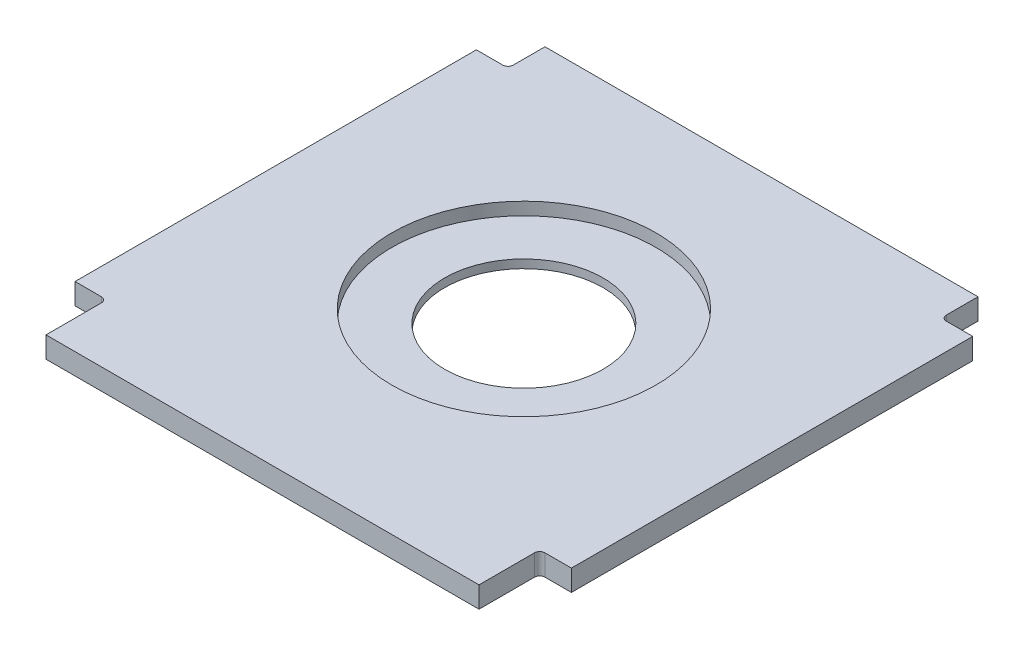
ISO-10303-21;
HEADER;
FILE_DESCRIPTION(('STEP AP214'),'2;1');
FILE_NAME('part.step','',(''),(''),'','','');
FILE_SCHEMA(('AUTOMOTIVE_DESIGN { 1 0 10303 214 1 1 1 1 }'));
ENDSEC;
DATA;
#1=APPLICATION_CONTEXT('core data for automotive mechanical design processes');
#2=APPLICATION_PROTOCOL_DEFINITION('international standard','automotive_design',2000,#1);
#3=PRODUCT_CONTEXT('',#1,'mechanical');
#4=PRODUCT('Part','Part','',(#3));
#5=PRODUCT_RELATED_PRODUCT_CATEGORY('part','',(#4));
#6=PRODUCT_DEFINITION_FORMATION('','',#4);
#7=PRODUCT_DEFINITION_CONTEXT('part definition',#1,'design');
#8=PRODUCT_DEFINITION('design','',#6,#7);
#9=PRODUCT_DEFINITION_SHAPE('','',#8);
#10=(LENGTH_UNIT() NAMED_UNIT(*) SI_UNIT(.MILLI.,.METRE.));
#11=(NAMED_UNIT(*) PLANE_ANGLE_UNIT() SI_UNIT($,.RADIAN.));
#12=(NAMED_UNIT(*) SI_UNIT($,.STERADIAN.) SOLID_ANGLE_UNIT());
#13=UNCERTAINTY_MEASURE_WITH_UNIT(LENGTH_MEASURE(1.E-05),#10,'distance_accuracy_value','');
#14=(GEOMETRIC_REPRESENTATION_CONTEXT(3) GLOBAL_UNCERTAINTY_ASSIGNED_CONTEXT((#13)) GLOBAL_UNIT_ASSIGNED_CONTEXT((#10,
#11,#12)) REPRESENTATION_CONTEXT('',''));
#15=CARTESIAN_POINT('',(0.,0.,0.));
#16=DIRECTION('',(0.,0.,1.));
#17=DIRECTION('',(1.,0.,0.));
#18=AXIS2_PLACEMENT_3D('',#15,#16,#17);
#19=CARTESIAN_POINT('',(0.,-0.00100000000000013,0.));
#20=DIRECTION('',(0.,1.,0.));
#21=DIRECTION('',(0.,0.,1.));
#22=AXIS2_PLACEMENT_3D('',#19,#20,#21);
#23=CYLINDRICAL_SURFACE('',#22,15.);
#24=CARTESIAN_POINT('',(0.,0.,0.));
#25=DIRECTION('',(0.,-1.,0.));
#26=DIRECTION('',(0.,0.,-1.));
#27=AXIS2_PLACEMENT_3D('',#24,#25,#26);
#28=CIRCLE('',#27,15.);
#29=CARTESIAN_POINT('',(0.,0.,-15.));
#30=VERTEX_POINT('',#29);
#31=EDGE_CURVE('E201',#30,#30,#28,.F.);
#32=ORIENTED_EDGE('',*,*,#31,.F.);
#33=EDGE_LOOP('',(#32));
#34=FACE_BOUND('',#33,.T.);
#35=CARTESIAN_POINT('',(0.,1.6,0.));
#36=DIRECTION('',(0.,1.,0.));
#37=DIRECTION('',(0.,0.,1.));
#38=AXIS2_PLACEMENT_3D('',#35,#36,#37);
#39=CIRCLE('',#38,15.);
#40=CARTESIAN_POINT('',(0.,1.6,15.));
#41=VERTEX_POINT('',#40);
#42=EDGE_CURVE('E374',#41,#41,#39,.T.);
#43=ORIENTED_EDGE('',*,*,#42,.T.);
#44=EDGE_LOOP('',(#43));
#45=FACE_BOUND('',#44,.T.);
#46=ADVANCED_FACE('F35',(#34,#45),#23,.F.);
#47=CARTESIAN_POINT('',(41.,4.,-38.));
#48=DIRECTION('',(0.,0.,1.));
#49=DIRECTION('',(1.,0.,0.));
#50=AXIS2_PLACEMENT_3D('',#47,#48,#49);
#51=PLANE('',#50);
#52=DIRECTION('',(-1.,0.,0.));
#53=VECTOR('',#52,1.);
#54=CARTESIAN_POINT('',(41.,0.,-38.));
#55=LINE('',#54,#53);
#56=CARTESIAN_POINT('',(47.,0.,-38.));
#57=VERTEX_POINT('',#56);
#58=CARTESIAN_POINT('',(42.,0.,-38.));
#59=VERTEX_POINT('',#58);
#60=EDGE_CURVE('E198',#57,#59,#55,.T.);
#61=ORIENTED_EDGE('',*,*,#60,.T.);
#62=DIRECTION('',(0.,-1.,0.));
#63=VECTOR('',#62,1.);
#64=CARTESIAN_POINT('',(42.,4.,-38.));
#65=LINE('',#64,#63);
#66=CARTESIAN_POINT('',(42.,4.,-38.));
#67=VERTEX_POINT('',#66);
#68=EDGE_CURVE('E254',#59,#67,#65,.F.);
#69=ORIENTED_EDGE('',*,*,#68,.T.);
#70=DIRECTION('',(-1.,0.,0.));
#71=VECTOR('',#70,1.);
#72=CARTESIAN_POINT('',(41.,4.,-38.));
#73=LINE('',#72,#71);
#74=CARTESIAN_POINT('',(47.,4.,-38.));
#75=VERTEX_POINT('',#74);
#76=EDGE_CURVE('E160',#75,#67,#73,.T.);
#77=ORIENTED_EDGE('',*,*,#76,.F.);
#78=DIRECTION('',(0.,-1.,0.));
#79=VECTOR('',#78,1.);
#80=CARTESIAN_POINT('',(47.,4.,-38.));
#81=LINE('',#80,#79);
#82=EDGE_CURVE('E197',#75,#57,#81,.T.);
#83=ORIENTED_EDGE('',*,*,#82,.T.);
#84=EDGE_LOOP('',(#61,#69,#77,#83));
#85=FACE_BOUND('',#84,.T.);
#86=ADVANCED_FACE('F276',(#85),#51,.F.);
#87=CARTESIAN_POINT('',(41.,4.,-38.));
#88=DIRECTION('',(-1.,0.,0.));
#89=DIRECTION('',(0.,0.,1.));
#90=AXIS2_PLACEMENT_3D('',#87,#88,#89);
#91=PLANE('',#90);
#92=DIRECTION('',(0.,0.,-1.));
#93=VECTOR('',#92,1.);
#94=CARTESIAN_POINT('',(41.,4.,-38.));
#95=LINE('',#94,#93);
#96=CARTESIAN_POINT('',(41.,4.,-39.));
#97=VERTEX_POINT('',#96);
#98=CARTESIAN_POINT('',(41.,4.,-45.));
#99=VERTEX_POINT('',#98);
#100=EDGE_CURVE('E147',#97,#99,#95,.T.);
#101=ORIENTED_EDGE('',*,*,#100,.F.);
#102=DIRECTION('',(0.,-1.,0.));
#103=VECTOR('',#102,1.);
#104=CARTESIAN_POINT('',(41.,0.,-39.));
#105=LINE('',#104,#103);
#106=CARTESIAN_POINT('',(41.,0.,-39.));
#107=VERTEX_POINT('',#106);
#108=EDGE_CURVE('E252',#97,#107,#105,.T.);
#109=ORIENTED_EDGE('',*,*,#108,.T.);
#110=DIRECTION('',(0.,0.,-1.));
#111=VECTOR('',#110,1.);
#112=CARTESIAN_POINT('',(41.,0.,-38.));
#113=LINE('',#112,#111);
#114=CARTESIAN_POINT('',(41.,0.,-45.));
#115=VERTEX_POINT('',#114);
#116=EDGE_CURVE('E166',#107,#115,#113,.T.);
#117=ORIENTED_EDGE('',*,*,#116,.T.);
#118=DIRECTION('',(0.,-1.,0.));
#119=VECTOR('',#118,1.);
#120=CARTESIAN_POINT('',(41.,4.,-45.));
#121=LINE('',#120,#119);
#122=EDGE_CURVE('E163',#99,#115,#121,.T.);
#123=ORIENTED_EDGE('',*,*,#122,.F.);
#124=EDGE_LOOP('',(#101,#109,#117,#123));
#125=FACE_BOUND('',#124,.T.);
#126=ADVANCED_FACE('F164',(#125),#91,.F.);
#127=CARTESIAN_POINT('',(-41.,4.,-45.));
#128=DIRECTION('',(0.,0.,1.));
#129=DIRECTION('',(1.,0.,0.));
#130=AXIS2_PLACEMENT_3D('',#127,#128,#129);
#131=PLANE('',#130);
#132=DIRECTION('',(-1.,0.,0.));
#133=VECTOR('',#132,1.);
#134=CARTESIAN_POINT('',(-41.,0.,-45.));
#135=LINE('',#134,#133);
#136=CARTESIAN_POINT('',(-41.,0.,-45.));
#137=VERTEX_POINT('',#136);
#138=EDGE_CURVE('E203',#115,#137,#135,.T.);
#139=ORIENTED_EDGE('',*,*,#138,.T.);
#140=DIRECTION('',(0.,-1.,0.));
#141=VECTOR('',#140,1.);
#142=CARTESIAN_POINT('',(-41.,4.,-45.));
#143=LINE('',#142,#141);
#144=CARTESIAN_POINT('',(-41.,4.,-45.));
#145=VERTEX_POINT('',#144);
#146=EDGE_CURVE('E170',#145,#137,#143,.T.);
#147=ORIENTED_EDGE('',*,*,#146,.F.);
#148=DIRECTION('',(-1.,0.,0.));
#149=VECTOR('',#148,1.);
#150=CARTESIAN_POINT('',(-41.,4.,-45.));
#151=LINE('',#150,#149);
#152=EDGE_CURVE('E153',#99,#145,#151,.T.);
#153=ORIENTED_EDGE('',*,*,#152,.F.);
#154=ORIENTED_EDGE('',*,*,#122,.T.);
#155=EDGE_LOOP('',(#139,#147,#153,#154));
#156=FACE_BOUND('',#155,.T.);
#157=ADVANCED_FACE('F172',(#156),#131,.F.);
#158=CARTESIAN_POINT('',(-41.,4.,-38.));
#159=DIRECTION('',(1.,0.,0.));
#160=DIRECTION('',(0.,0.,-1.));
#161=AXIS2_PLACEMENT_3D('',#158,#159,#160);
#162=PLANE('',#161);
#163=DIRECTION('',(0.,0.,1.));
#164=VECTOR('',#163,1.);
#165=CARTESIAN_POINT('',(-41.,0.,-38.));
#166=LINE('',#165,#164);
#167=CARTESIAN_POINT('',(-41.,0.,-39.));
#168=VERTEX_POINT('',#167);
#169=EDGE_CURVE('E205',#137,#168,#166,.T.);
#170=ORIENTED_EDGE('',*,*,#169,.T.);
#171=DIRECTION('',(0.,-1.,0.));
#172=VECTOR('',#171,1.);
#173=CARTESIAN_POINT('',(-41.,4.,-39.));
#174=LINE('',#173,#172);
#175=CARTESIAN_POINT('',(-41.,4.,-39.));
#176=VERTEX_POINT('',#175);
#177=EDGE_CURVE('E250',#168,#176,#174,.F.);
#178=ORIENTED_EDGE('',*,*,#177,.T.);
#179=DIRECTION('',(0.,0.,1.));
#180=VECTOR('',#179,1.);
#181=CARTESIAN_POINT('',(-41.,4.,-38.));
#182=LINE('',#181,#180);
#183=EDGE_CURVE('E175',#145,#176,#182,.T.);
#184=ORIENTED_EDGE('',*,*,#183,.F.);
#185=ORIENTED_EDGE('',*,*,#146,.T.);
#186=EDGE_LOOP('',(#170,#178,#184,#185));
#187=FACE_BOUND('',#186,.T.);
#188=ADVANCED_FACE('F339',(#187),#162,.F.);
#189=CARTESIAN_POINT('',(-41.,4.,-38.));
#190=DIRECTION('',(0.,0.,1.));
#191=DIRECTION('',(1.,0.,0.));
#192=AXIS2_PLACEMENT_3D('',#189,#190,#191);
#193=PLANE('',#192);
#194=DIRECTION('',(-1.,0.,0.));
#195=VECTOR('',#194,1.);
#196=CARTESIAN_POINT('',(-41.,4.,-38.));
#197=LINE('',#196,#195);
#198=CARTESIAN_POINT('',(-42.,4.,-38.));
#199=VERTEX_POINT('',#198);
#200=CARTESIAN_POINT('',(-47.,4.,-38.));
#201=VERTEX_POINT('',#200);
#202=EDGE_CURVE('E177',#199,#201,#197,.T.);
#203=ORIENTED_EDGE('',*,*,#202,.F.);
#204=DIRECTION('',(0.,-1.,0.));
#205=VECTOR('',#204,1.);
#206=CARTESIAN_POINT('',(-42.,0.,-38.));
#207=LINE('',#206,#205);
#208=CARTESIAN_POINT('',(-42.,0.,-38.));
#209=VERTEX_POINT('',#208);
#210=EDGE_CURVE('E247',#199,#209,#207,.T.);
#211=ORIENTED_EDGE('',*,*,#210,.T.);
#212=DIRECTION('',(-1.,0.,0.));
#213=VECTOR('',#212,1.);
#214=CARTESIAN_POINT('',(-41.,0.,-38.));
#215=LINE('',#214,#213);
#216=CARTESIAN_POINT('',(-47.,0.,-38.));
#217=VERTEX_POINT('',#216);
#218=EDGE_CURVE('E208',#209,#217,#215,.T.);
#219=ORIENTED_EDGE('',*,*,#218,.T.);
#220=DIRECTION('',(0.,-1.,0.));
#221=VECTOR('',#220,1.);
#222=CARTESIAN_POINT('',(-47.,4.,-38.));
#223=LINE('',#222,#221);
#224=EDGE_CURVE('E239',#201,#217,#223,.T.);
#225=ORIENTED_EDGE('',*,*,#224,.F.);
#226=EDGE_LOOP('',(#203,#211,#219,#225));
#227=FACE_BOUND('',#226,.T.);
#228=ADVANCED_FACE('F335',(#227),#193,.F.);
#229=CARTESIAN_POINT('',(-47.,4.,-38.));
#230=DIRECTION('',(1.,0.,0.));
#231=DIRECTION('',(0.,0.,-1.));
#232=AXIS2_PLACEMENT_3D('',#229,#230,#231);
#233=PLANE('',#232);
#234=DIRECTION('',(0.,0.,1.));
#235=VECTOR('',#234,1.);
#236=CARTESIAN_POINT('',(-47.,0.,-38.));
#237=LINE('',#236,#235);
#238=CARTESIAN_POINT('',(-47.,0.,38.));
#239=VERTEX_POINT('',#238);
#240=EDGE_CURVE('E210',#217,#239,#237,.T.);
#241=ORIENTED_EDGE('',*,*,#240,.T.);
#242=DIRECTION('',(0.,-1.,0.));
#243=VECTOR('',#242,1.);
#244=CARTESIAN_POINT('',(-47.,4.,38.));
#245=LINE('',#244,#243);
#246=CARTESIAN_POINT('',(-47.,4.,38.));
#247=VERTEX_POINT('',#246);
#248=EDGE_CURVE('E236',#247,#239,#245,.T.);
#249=ORIENTED_EDGE('',*,*,#248,.F.);
#250=DIRECTION('',(0.,0.,1.));
#251=VECTOR('',#250,1.);
#252=CARTESIAN_POINT('',(-47.,4.,-38.));
#253=LINE('',#252,#251);
#254=EDGE_CURVE('E182',#201,#247,#253,.T.);
#255=ORIENTED_EDGE('',*,*,#254,.F.);
#256=ORIENTED_EDGE('',*,*,#224,.T.);
#257=EDGE_LOOP('',(#241,#249,#255,#256));
#258=FACE_BOUND('',#257,.T.);
#259=ADVANCED_FACE('F331',(#258),#233,.F.);
#260=CARTESIAN_POINT('',(-41.,4.,38.));
#261=DIRECTION('',(0.,0.,-1.));
#262=DIRECTION('',(-1.,0.,0.));
#263=AXIS2_PLACEMENT_3D('',#260,#261,#262);
#264=PLANE('',#263);
#265=DIRECTION('',(1.,0.,0.));
#266=VECTOR('',#265,1.);
#267=CARTESIAN_POINT('',(-41.,0.,38.));
#268=LINE('',#267,#266);
#269=CARTESIAN_POINT('',(-42.,0.,38.));
#270=VERTEX_POINT('',#269);
#271=EDGE_CURVE('E212',#239,#270,#268,.T.);
#272=ORIENTED_EDGE('',*,*,#271,.T.);
#273=DIRECTION('',(0.,-1.,0.));
#274=VECTOR('',#273,1.);
#275=CARTESIAN_POINT('',(-42.,4.,38.));
#276=LINE('',#275,#274);
#277=CARTESIAN_POINT('',(-42.,4.,38.));
#278=VERTEX_POINT('',#277);
#279=EDGE_CURVE('E245',#270,#278,#276,.F.);
#280=ORIENTED_EDGE('',*,*,#279,.T.);
#281=DIRECTION('',(1.,0.,0.));
#282=VECTOR('',#281,1.);
#283=CARTESIAN_POINT('',(-41.,4.,38.));
#284=LINE('',#283,#282);
#285=EDGE_CURVE('E184',#247,#278,#284,.T.);
#286=ORIENTED_EDGE('',*,*,#285,.F.);
#287=ORIENTED_EDGE('',*,*,#248,.T.);
#288=EDGE_LOOP('',(#272,#280,#286,#287));
#289=FACE_BOUND('',#288,.T.);
#290=ADVANCED_FACE('F327',(#289),#264,.F.);
#291=CARTESIAN_POINT('',(-41.,4.,38.));
#292=DIRECTION('',(1.,0.,0.));
#293=DIRECTION('',(0.,0.,-1.));
#294=AXIS2_PLACEMENT_3D('',#291,#292,#293);
#295=PLANE('',#294);
#296=DIRECTION('',(0.,0.,1.));
#297=VECTOR('',#296,1.);
#298=CARTESIAN_POINT('',(-41.,4.,38.));
#299=LINE('',#298,#297);
#300=CARTESIAN_POINT('',(-41.,4.,39.));
#301=VERTEX_POINT('',#300);
#302=CARTESIAN_POINT('',(-41.,4.,49.5));
#303=VERTEX_POINT('',#302);
#304=EDGE_CURVE('E187',#301,#303,#299,.T.);
#305=ORIENTED_EDGE('',*,*,#304,.F.);
#306=DIRECTION('',(0.,-1.,0.));
#307=VECTOR('',#306,1.);
#308=CARTESIAN_POINT('',(-41.,0.,39.));
#309=LINE('',#308,#307);
#310=CARTESIAN_POINT('',(-41.,0.,39.));
#311=VERTEX_POINT('',#310);
#312=EDGE_CURVE('E169',#301,#311,#309,.T.);
#313=ORIENTED_EDGE('',*,*,#312,.T.);
#314=DIRECTION('',(0.,0.,1.));
#315=VECTOR('',#314,1.);
#316=CARTESIAN_POINT('',(-41.,0.,38.));
#317=LINE('',#316,#315);
#318=CARTESIAN_POINT('',(-41.,0.,49.5));
#319=VERTEX_POINT('',#318);
#320=EDGE_CURVE('E215',#311,#319,#317,.T.);
#321=ORIENTED_EDGE('',*,*,#320,.T.);
#322=DIRECTION('',(0.,-1.,0.));
#323=VECTOR('',#322,1.);
#324=CARTESIAN_POINT('',(-41.,4.,49.5));
#325=LINE('',#324,#323);
#326=EDGE_CURVE('E233',#303,#319,#325,.T.);
#327=ORIENTED_EDGE('',*,*,#326,.F.);
#328=EDGE_LOOP('',(#305,#313,#321,#327));
#329=FACE_BOUND('',#328,.T.);
#330=ADVANCED_FACE('F323',(#329),#295,.F.);
#331=CARTESIAN_POINT('',(-41.,4.,49.5));
#332=DIRECTION('',(0.,0.,-1.));
#333=DIRECTION('',(-1.,0.,0.));
#334=AXIS2_PLACEMENT_3D('',#331,#332,#333);
#335=PLANE('',#334);
#336=DIRECTION('',(1.,0.,0.));
#337=VECTOR('',#336,1.);
#338=CARTESIAN_POINT('',(-41.,0.,49.5));
#339=LINE('',#338,#337);
#340=CARTESIAN_POINT('',(41.,0.,49.5));
#341=VERTEX_POINT('',#340);
#342=EDGE_CURVE('E217',#319,#341,#339,.T.);
#343=ORIENTED_EDGE('',*,*,#342,.T.);
#344=DIRECTION('',(0.,-1.,0.));
#345=VECTOR('',#344,1.);
#346=CARTESIAN_POINT('',(41.,4.,49.5));
#347=LINE('',#346,#345);
#348=CARTESIAN_POINT('',(41.,4.,49.5));
#349=VERTEX_POINT('',#348);
#350=EDGE_CURVE('E230',#349,#341,#347,.T.);
#351=ORIENTED_EDGE('',*,*,#350,.F.);
#352=DIRECTION('',(1.,0.,0.));
#353=VECTOR('',#352,1.);
#354=CARTESIAN_POINT('',(-41.,4.,49.5));
#355=LINE('',#354,#353);
#356=EDGE_CURVE('E189',#303,#349,#355,.T.);
#357=ORIENTED_EDGE('',*,*,#356,.F.);
#358=ORIENTED_EDGE('',*,*,#326,.T.);
#359=EDGE_LOOP('',(#343,#351,#357,#358));
#360=FACE_BOUND('',#359,.T.);
#361=ADVANCED_FACE('F320',(#360),#335,.F.);
#362=CARTESIAN_POINT('',(41.,4.,38.));
#363=DIRECTION('',(-1.,0.,0.));
#364=DIRECTION('',(0.,0.,1.));
#365=AXIS2_PLACEMENT_3D('',#362,#363,#364);
#366=PLANE('',#365);
#367=DIRECTION('',(0.,0.,-1.));
#368=VECTOR('',#367,1.);
#369=CARTESIAN_POINT('',(41.,0.,38.));
#370=LINE('',#369,#368);
#371=CARTESIAN_POINT('',(41.,0.,39.));
#372=VERTEX_POINT('',#371);
#373=EDGE_CURVE('E219',#341,#372,#370,.T.);
#374=ORIENTED_EDGE('',*,*,#373,.T.);
#375=DIRECTION('',(0.,-1.,0.));
#376=VECTOR('',#375,1.);
#377=CARTESIAN_POINT('',(41.,4.,39.));
#378=LINE('',#377,#376);
#379=CARTESIAN_POINT('',(41.,4.,39.));
#380=VERTEX_POINT('',#379);
#381=EDGE_CURVE('E50',#372,#380,#378,.F.);
#382=ORIENTED_EDGE('',*,*,#381,.T.);
#383=DIRECTION('',(0.,0.,-1.));
#384=VECTOR('',#383,1.);
#385=CARTESIAN_POINT('',(41.,4.,38.));
#386=LINE('',#385,#384);
#387=EDGE_CURVE('E191',#349,#380,#386,.T.);
#388=ORIENTED_EDGE('',*,*,#387,.F.);
#389=ORIENTED_EDGE('',*,*,#350,.T.);
#390=EDGE_LOOP('',(#374,#382,#388,#389));
#391=FACE_BOUND('',#390,.T.);
#392=ADVANCED_FACE('F316',(#391),#366,.F.);
#393=CARTESIAN_POINT('',(41.,4.,38.));
#394=DIRECTION('',(0.,0.,-1.));
#395=DIRECTION('',(-1.,0.,0.));
#396=AXIS2_PLACEMENT_3D('',#393,#394,#395);
#397=PLANE('',#396);
#398=DIRECTION('',(1.,0.,0.));
#399=VECTOR('',#398,1.);
#400=CARTESIAN_POINT('',(41.,4.,38.));
#401=LINE('',#400,#399);
#402=CARTESIAN_POINT('',(42.,4.,38.));
#403=VERTEX_POINT('',#402);
#404=CARTESIAN_POINT('',(47.,4.,38.));
#405=VERTEX_POINT('',#404);
#406=EDGE_CURVE('E193',#403,#405,#401,.T.);
#407=ORIENTED_EDGE('',*,*,#406,.F.);
#408=DIRECTION('',(0.,-1.,0.));
#409=VECTOR('',#408,1.);
#410=CARTESIAN_POINT('',(42.,0.,38.));
#411=LINE('',#410,#409);
#412=CARTESIAN_POINT('',(42.,0.,38.));
#413=VERTEX_POINT('',#412);
#414=EDGE_CURVE('E256',#403,#413,#411,.T.);
#415=ORIENTED_EDGE('',*,*,#414,.T.);
#416=DIRECTION('',(1.,0.,0.));
#417=VECTOR('',#416,1.);
#418=CARTESIAN_POINT('',(41.,0.,38.));
#419=LINE('',#418,#417);
#420=CARTESIAN_POINT('',(47.,0.,38.));
#421=VERTEX_POINT('',#420);
#422=EDGE_CURVE('E221',#413,#421,#419,.T.);
#423=ORIENTED_EDGE('',*,*,#422,.T.);
#424=DIRECTION('',(0.,-1.,0.));
#425=VECTOR('',#424,1.);
#426=CARTESIAN_POINT('',(47.,4.,38.));
#427=LINE('',#426,#425);
#428=EDGE_CURVE('E227',#405,#421,#427,.T.);
#429=ORIENTED_EDGE('',*,*,#428,.F.);
#430=EDGE_LOOP('',(#407,#415,#423,#429));
#431=FACE_BOUND('',#430,.T.);
#432=ADVANCED_FACE('F312',(#431),#397,.F.);
#433=CARTESIAN_POINT('',(47.,4.,-38.));
#434=DIRECTION('',(-1.,0.,0.));
#435=DIRECTION('',(0.,0.,1.));
#436=AXIS2_PLACEMENT_3D('',#433,#434,#435);
#437=PLANE('',#436);
#438=DIRECTION('',(0.,0.,-1.));
#439=VECTOR('',#438,1.);
#440=CARTESIAN_POINT('',(47.,0.,-38.));
#441=LINE('',#440,#439);
#442=EDGE_CURVE('E223',#421,#57,#441,.T.);
#443=ORIENTED_EDGE('',*,*,#442,.T.);
#444=ORIENTED_EDGE('',*,*,#82,.F.);
#445=DIRECTION('',(0.,0.,-1.));
#446=VECTOR('',#445,1.);
#447=CARTESIAN_POINT('',(47.,4.,-38.));
#448=LINE('',#447,#446);
#449=EDGE_CURVE('E195',#405,#75,#448,.T.);
#450=ORIENTED_EDGE('',*,*,#449,.F.);
#451=ORIENTED_EDGE('',*,*,#428,.T.);
#452=EDGE_LOOP('',(#443,#444,#450,#451));
#453=FACE_BOUND('',#452,.T.);
#454=ADVANCED_FACE('F305',(#453),#437,.F.);
#455=CARTESIAN_POINT('',(0.,4.,0.));
#456=DIRECTION('',(0.,-1.,0.));
#457=DIRECTION('',(0.,0.,-1.));
#458=AXIS2_PLACEMENT_3D('',#455,#456,#457);
#459=PLANE('',#458);
#460=CARTESIAN_POINT('',(0.,4.,0.));
#461=DIRECTION('',(0.,1.,0.));
#462=DIRECTION('',(0.,0.,1.));
#463=AXIS2_PLACEMENT_3D('',#460,#461,#462);
#464=CIRCLE('',#463,25.);
#465=CARTESIAN_POINT('',(0.,4.,25.));
#466=VERTEX_POINT('',#465);
#467=EDGE_CURVE('E371',#466,#466,#464,.T.);
#468=ORIENTED_EDGE('',*,*,#467,.F.);
#469=EDGE_LOOP('',(#468));
#470=FACE_BOUND('',#469,.T.);
#471=ORIENTED_EDGE('',*,*,#76,.T.);
#472=CARTESIAN_POINT('',(42.,4.,-39.));
#473=DIRECTION('',(0.,-1.,0.));
#474=DIRECTION('',(0.,0.,-1.));
#475=AXIS2_PLACEMENT_3D('',#472,#473,#474);
#476=CIRCLE('',#475,1.);
#477=EDGE_CURVE('E156',#67,#97,#476,.T.);
#478=ORIENTED_EDGE('',*,*,#477,.T.);
#479=ORIENTED_EDGE('',*,*,#100,.T.);
#480=ORIENTED_EDGE('',*,*,#152,.T.);
#481=ORIENTED_EDGE('',*,*,#183,.T.);
#482=CARTESIAN_POINT('',(-42.,4.,-39.));
#483=DIRECTION('',(0.,-1.,0.));
#484=DIRECTION('',(0.,0.,-1.));
#485=AXIS2_PLACEMENT_3D('',#482,#483,#484);
#486=CIRCLE('',#485,1.);
#487=EDGE_CURVE('E266',#176,#199,#486,.T.);
#488=ORIENTED_EDGE('',*,*,#487,.T.);
#489=ORIENTED_EDGE('',*,*,#202,.T.);
#490=ORIENTED_EDGE('',*,*,#254,.T.);
#491=ORIENTED_EDGE('',*,*,#285,.T.);
#492=CARTESIAN_POINT('',(-42.,4.,39.));
#493=DIRECTION('',(0.,-1.,0.));
#494=DIRECTION('',(0.,0.,-1.));
#495=AXIS2_PLACEMENT_3D('',#492,#493,#494);
#496=CIRCLE('',#495,1.);
#497=EDGE_CURVE('E262',#278,#301,#496,.T.);
#498=ORIENTED_EDGE('',*,*,#497,.T.);
#499=ORIENTED_EDGE('',*,*,#304,.T.);
#500=ORIENTED_EDGE('',*,*,#356,.T.);
#501=ORIENTED_EDGE('',*,*,#387,.T.);
#502=CARTESIAN_POINT('',(42.,4.,39.));
#503=DIRECTION('',(0.,-1.,0.));
#504=DIRECTION('',(0.,0.,-1.));
#505=AXIS2_PLACEMENT_3D('',#502,#503,#504);
#506=CIRCLE('',#505,1.);
#507=EDGE_CURVE('E11',#380,#403,#506,.T.);
#508=ORIENTED_EDGE('',*,*,#507,.T.);
#509=ORIENTED_EDGE('',*,*,#406,.T.);
#510=ORIENTED_EDGE('',*,*,#449,.T.);
#511=EDGE_LOOP('',(#471,#478,#479,#480,#481,#488,#489,#490,#491,#498,#499,#500,#501,#508,#509,#510));
#512=FACE_BOUND('',#511,.T.);
#513=ADVANCED_FACE('F150',(#470,#512),#459,.F.);
#514=CARTESIAN_POINT('',(0.,0.,0.));
#515=DIRECTION('',(0.,-1.,0.));
#516=DIRECTION('',(0.,0.,-1.));
#517=AXIS2_PLACEMENT_3D('',#514,#515,#516);
#518=PLANE('',#517);
#519=ORIENTED_EDGE('',*,*,#31,.T.);
#520=EDGE_LOOP('',(#519));
#521=FACE_BOUND('',#520,.T.);
#522=ORIENTED_EDGE('',*,*,#60,.F.);
#523=ORIENTED_EDGE('',*,*,#442,.F.);
#524=ORIENTED_EDGE('',*,*,#422,.F.);
#525=CARTESIAN_POINT('',(42.,0.,39.));
#526=DIRECTION('',(0.,-1.,0.));
#527=DIRECTION('',(0.,0.,-1.));
#528=AXIS2_PLACEMENT_3D('',#525,#526,#527);
#529=CIRCLE('',#528,1.);
#530=EDGE_CURVE('E43',#413,#372,#529,.F.);
#531=ORIENTED_EDGE('',*,*,#530,.T.);
#532=ORIENTED_EDGE('',*,*,#373,.F.);
#533=ORIENTED_EDGE('',*,*,#342,.F.);
#534=ORIENTED_EDGE('',*,*,#320,.F.);
#535=CARTESIAN_POINT('',(-42.,0.,39.));
#536=DIRECTION('',(0.,-1.,0.));
#537=DIRECTION('',(0.,0.,-1.));
#538=AXIS2_PLACEMENT_3D('',#535,#536,#537);
#539=CIRCLE('',#538,1.);
#540=EDGE_CURVE('E260',#311,#270,#539,.F.);
#541=ORIENTED_EDGE('',*,*,#540,.T.);
#542=ORIENTED_EDGE('',*,*,#271,.F.);
#543=ORIENTED_EDGE('',*,*,#240,.F.);
#544=ORIENTED_EDGE('',*,*,#218,.F.);
#545=CARTESIAN_POINT('',(-42.,0.,-39.));
#546=DIRECTION('',(0.,-1.,0.));
#547=DIRECTION('',(0.,0.,-1.));
#548=AXIS2_PLACEMENT_3D('',#545,#546,#547);
#549=CIRCLE('',#548,1.);
#550=EDGE_CURVE('E264',#209,#168,#549,.F.);
#551=ORIENTED_EDGE('',*,*,#550,.T.);
#552=ORIENTED_EDGE('',*,*,#169,.F.);
#553=ORIENTED_EDGE('',*,*,#138,.F.);
#554=ORIENTED_EDGE('',*,*,#116,.F.);
#555=CARTESIAN_POINT('',(42.,0.,-39.));
#556=DIRECTION('',(0.,-1.,0.));
#557=DIRECTION('',(0.,0.,-1.));
#558=AXIS2_PLACEMENT_3D('',#555,#556,#557);
#559=CIRCLE('',#558,1.);
#560=EDGE_CURVE('E268',#107,#59,#559,.F.);
#561=ORIENTED_EDGE('',*,*,#560,.T.);
#562=EDGE_LOOP('',(#522,#523,#524,#531,#532,#533,#534,#541,#542,#543,#544,#551,#552,#553,#554,#561));
#563=FACE_BOUND('',#562,.T.);
#564=ADVANCED_FACE('F271',(#521,#563),#518,.T.);
#565=CARTESIAN_POINT('',(-42.,4.,39.));
#566=DIRECTION('',(0.,1.,0.));
#567=DIRECTION('',(0.,0.,1.));
#568=AXIS2_PLACEMENT_3D('',#565,#566,#567);
#569=CYLINDRICAL_SURFACE('',#568,1.);
#570=ORIENTED_EDGE('',*,*,#497,.F.);
#571=ORIENTED_EDGE('',*,*,#279,.F.);
#572=ORIENTED_EDGE('',*,*,#540,.F.);
#573=ORIENTED_EDGE('',*,*,#312,.F.);
#574=EDGE_LOOP('',(#570,#571,#572,#573));
#575=FACE_BOUND('',#574,.T.);
#576=ADVANCED_FACE('F288',(#575),#569,.F.);
#577=CARTESIAN_POINT('',(-42.,4.,-39.));
#578=DIRECTION('',(0.,1.,0.));
#579=DIRECTION('',(0.,0.,1.));
#580=AXIS2_PLACEMENT_3D('',#577,#578,#579);
#581=CYLINDRICAL_SURFACE('',#580,1.);
#582=ORIENTED_EDGE('',*,*,#487,.F.);
#583=ORIENTED_EDGE('',*,*,#177,.F.);
#584=ORIENTED_EDGE('',*,*,#550,.F.);
#585=ORIENTED_EDGE('',*,*,#210,.F.);
#586=EDGE_LOOP('',(#582,#583,#584,#585));
#587=FACE_BOUND('',#586,.T.);
#588=ADVANCED_FACE('F281',(#587),#581,.F.);
#589=CARTESIAN_POINT('',(42.,4.,-39.));
#590=DIRECTION('',(0.,1.,0.));
#591=DIRECTION('',(0.,0.,1.));
#592=AXIS2_PLACEMENT_3D('',#589,#590,#591);
#593=CYLINDRICAL_SURFACE('',#592,1.);
#594=ORIENTED_EDGE('',*,*,#477,.F.);
#595=ORIENTED_EDGE('',*,*,#68,.F.);
#596=ORIENTED_EDGE('',*,*,#560,.F.);
#597=ORIENTED_EDGE('',*,*,#108,.F.);
#598=EDGE_LOOP('',(#594,#595,#596,#597));
#599=FACE_BOUND('',#598,.T.);
#600=ADVANCED_FACE('F279',(#599),#593,.F.);
#601=CARTESIAN_POINT('',(42.,4.,39.));
#602=DIRECTION('',(0.,1.,0.));
#603=DIRECTION('',(0.,0.,1.));
#604=AXIS2_PLACEMENT_3D('',#601,#602,#603);
#605=CYLINDRICAL_SURFACE('',#604,1.);
#606=ORIENTED_EDGE('',*,*,#507,.F.);
#607=ORIENTED_EDGE('',*,*,#381,.F.);
#608=ORIENTED_EDGE('',*,*,#530,.F.);
#609=ORIENTED_EDGE('',*,*,#414,.F.);
#610=EDGE_LOOP('',(#606,#607,#608,#609));
#611=FACE_BOUND('',#610,.T.);
#612=ADVANCED_FACE('F37',(#611),#605,.F.);
#613=CARTESIAN_POINT('',(0.,1.6,0.));
#614=DIRECTION('',(0.,1.,0.));
#615=DIRECTION('',(0.,0.,1.));
#616=AXIS2_PLACEMENT_3D('',#613,#614,#615);
#617=CYLINDRICAL_SURFACE('',#616,25.);
#618=CARTESIAN_POINT('',(0.,1.6,0.));
#619=DIRECTION('',(0.,1.,0.));
#620=DIRECTION('',(0.,0.,1.));
#621=AXIS2_PLACEMENT_3D('',#618,#619,#620);
#622=CIRCLE('',#621,25.);
#623=CARTESIAN_POINT('',(0.,1.6,25.));
#624=VERTEX_POINT('',#623);
#625=EDGE_CURVE('E370',#624,#624,#622,.T.);
#626=ORIENTED_EDGE('',*,*,#625,.F.);
#627=EDGE_LOOP('',(#626));
#628=FACE_BOUND('',#627,.T.);
#629=ORIENTED_EDGE('',*,*,#467,.T.);
#630=EDGE_LOOP('',(#629));
#631=FACE_BOUND('',#630,.T.);
#632=ADVANCED_FACE('F286',(#628,#631),#617,.F.);
#633=CARTESIAN_POINT('',(0.,1.6,0.));
#634=DIRECTION('',(0.,1.,0.));
#635=DIRECTION('',(0.,0.,1.));
#636=AXIS2_PLACEMENT_3D('',#633,#634,#635);
#637=PLANE('',#636);
#638=ORIENTED_EDGE('',*,*,#42,.F.);
#639=EDGE_LOOP('',(#638));
#640=FACE_BOUND('',#639,.T.);
#641=ORIENTED_EDGE('',*,*,#625,.T.);
#642=EDGE_LOOP('',(#641));
#643=FACE_BOUND('',#642,.T.);
#644=ADVANCED_FACE('F380',(#640,#643),#637,.T.);
#645=CLOSED_SHELL('',(#46,#86,#126,#157,#188,#228,#259,#290,#330,#361,#392,#432,#454,#513,#564,
#576,#588,#600,#612,#632,#644));
#646=MANIFOLD_SOLID_BREP('B2',#645);
#647=ADVANCED_BREP_SHAPE_REPRESENTATION('',(#18,#646),#14);
#648=SHAPE_DEFINITION_REPRESENTATION(#9,#647);
ENDSEC;
END-ISO-10303-21;
